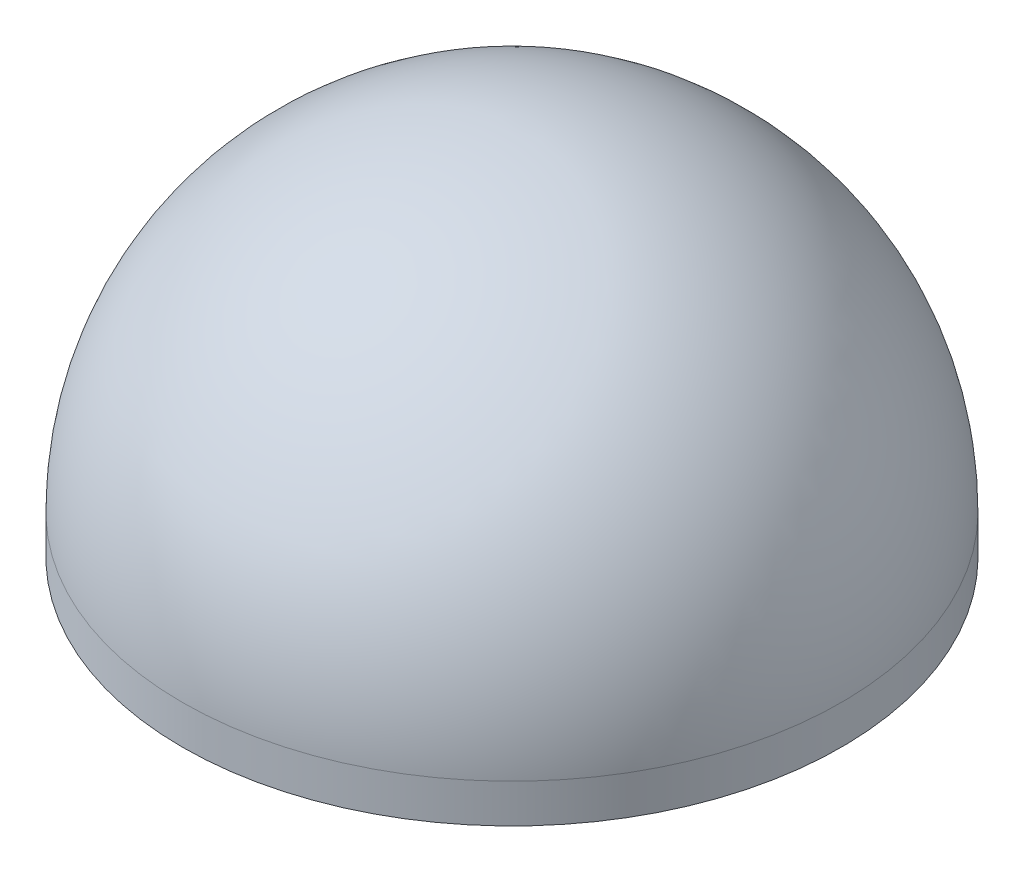
ISO-10303-21;
HEADER;
FILE_DESCRIPTION(('STEP AP214'),'2;1');
FILE_NAME('part.step','',(''),(''),'','','');
FILE_SCHEMA(('AUTOMOTIVE_DESIGN { 1 0 10303 214 1 1 1 1 }'));
ENDSEC;
DATA;
#1=APPLICATION_CONTEXT('core data for automotive mechanical design processes');
#2=APPLICATION_PROTOCOL_DEFINITION('international standard','automotive_design',2000,#1);
#3=PRODUCT_CONTEXT('',#1,'mechanical');
#4=PRODUCT('Part','Part','',(#3));
#5=PRODUCT_RELATED_PRODUCT_CATEGORY('part','',(#4));
#6=PRODUCT_DEFINITION_FORMATION('','',#4);
#7=PRODUCT_DEFINITION_CONTEXT('part definition',#1,'design');
#8=PRODUCT_DEFINITION('design','',#6,#7);
#9=PRODUCT_DEFINITION_SHAPE('','',#8);
#10=(LENGTH_UNIT() NAMED_UNIT(*) SI_UNIT(.MILLI.,.METRE.));
#11=(NAMED_UNIT(*) PLANE_ANGLE_UNIT() SI_UNIT($,.RADIAN.));
#12=(NAMED_UNIT(*) SI_UNIT($,.STERADIAN.) SOLID_ANGLE_UNIT());
#13=UNCERTAINTY_MEASURE_WITH_UNIT(LENGTH_MEASURE(1.E-05),#10,'distance_accuracy_value','');
#14=(GEOMETRIC_REPRESENTATION_CONTEXT(3) GLOBAL_UNCERTAINTY_ASSIGNED_CONTEXT((#13)) GLOBAL_UNIT_ASSIGNED_CONTEXT((#10,
#11,#12)) REPRESENTATION_CONTEXT('',''));
#15=CARTESIAN_POINT('',(0.,0.,0.));
#16=DIRECTION('',(0.,0.,1.));
#17=DIRECTION('',(1.,0.,0.));
#18=AXIS2_PLACEMENT_3D('',#15,#16,#17);
#19=CARTESIAN_POINT('',(0.,2.,0.));
#20=DIRECTION('',(0.,-1.,0.));
#21=DIRECTION('',(0.,0.,-1.));
#22=AXIS2_PLACEMENT_3D('',#19,#20,#21);
#23=CYLINDRICAL_SURFACE('',#22,17.);
#24=CARTESIAN_POINT('',(0.,2.,0.));
#25=DIRECTION('',(0.,1.,0.));
#26=DIRECTION('',(0.,0.,1.));
#27=AXIS2_PLACEMENT_3D('',#24,#25,#26);
#28=CIRCLE('',#27,17.);
#29=CARTESIAN_POINT('',(0.,2.,17.));
#30=VERTEX_POINT('',#29);
#31=EDGE_CURVE('E10',#30,#30,#28,.T.);
#32=ORIENTED_EDGE('',*,*,#31,.F.);
#33=EDGE_LOOP('',(#32));
#34=FACE_BOUND('',#33,.T.);
#35=CARTESIAN_POINT('',(0.,0.,0.));
#36=DIRECTION('',(0.,1.,0.));
#37=DIRECTION('',(0.,0.,1.));
#38=AXIS2_PLACEMENT_3D('',#35,#36,#37);
#39=CIRCLE('',#38,17.);
#40=CARTESIAN_POINT('',(0.,0.,17.));
#41=VERTEX_POINT('',#40);
#42=EDGE_CURVE('E35',#41,#41,#39,.T.);
#43=ORIENTED_EDGE('',*,*,#42,.T.);
#44=EDGE_LOOP('',(#43));
#45=FACE_BOUND('',#44,.T.);
#46=ADVANCED_FACE('F32',(#34,#45),#23,.T.);
#47=CARTESIAN_POINT('',(0.,0.,0.));
#48=DIRECTION('',(0.,1.,0.));
#49=DIRECTION('',(0.,0.,1.));
#50=AXIS2_PLACEMENT_3D('',#47,#48,#49);
#51=PLANE('',#50);
#52=CARTESIAN_POINT('',(0.,0.,0.));
#53=DIRECTION('',(0.,-1.,0.));
#54=DIRECTION('',(0.,0.,-1.));
#55=AXIS2_PLACEMENT_3D('',#52,#53,#54);
#56=CIRCLE('',#55,11.);
#57=CARTESIAN_POINT('',(0.,0.,-11.));
#58=VERTEX_POINT('',#57);
#59=EDGE_CURVE('E44',#58,#58,#56,.T.);
#60=ORIENTED_EDGE('',*,*,#59,.F.);
#61=EDGE_LOOP('',(#60));
#62=FACE_BOUND('',#61,.T.);
#63=ORIENTED_EDGE('',*,*,#42,.F.);
#64=EDGE_LOOP('',(#63));
#65=FACE_BOUND('',#64,.T.);
#66=ADVANCED_FACE('F59',(#62,#65),#51,.F.);
#67=CARTESIAN_POINT('',(0.,2.,0.));
#68=DIRECTION('',(-1.,0.,0.));
#69=DIRECTION('',(0.,0.,1.));
#70=AXIS2_PLACEMENT_3D('',#67,#68,#69);
#71=SPHERICAL_SURFACE('',#70,17.);
#72=CARTESIAN_POINT('',(0.,2.,0.));
#73=DIRECTION('',(0.,1.,0.));
#74=DIRECTION('',(0.,0.,1.));
#75=AXIS2_PLACEMENT_3D('',#72,#73,#74);
#76=SPHERICAL_SURFACE('',#75,17.);
#77=ORIENTED_EDGE('',*,*,#31,.T.);
#78=EDGE_LOOP('',(#77));
#79=FACE_BOUND('',#78,.T.);
#80=ADVANCED_FACE('F55',(#79),#76,.T.);
#81=CARTESIAN_POINT('',(0.,4.,0.));
#82=DIRECTION('',(0.,-1.,0.));
#83=DIRECTION('',(0.,0.,-1.));
#84=AXIS2_PLACEMENT_3D('',#81,#82,#83);
#85=CYLINDRICAL_SURFACE('',#84,11.);
#86=CARTESIAN_POINT('',(0.,4.,0.));
#87=DIRECTION('',(0.,-1.,0.));
#88=DIRECTION('',(0.,0.,-1.));
#89=AXIS2_PLACEMENT_3D('',#86,#87,#88);
#90=CIRCLE('',#89,11.);
#91=CARTESIAN_POINT('',(0.,4.,-11.));
#92=VERTEX_POINT('',#91);
#93=EDGE_CURVE('E42',#92,#92,#90,.T.);
#94=ORIENTED_EDGE('',*,*,#93,.F.);
#95=EDGE_LOOP('',(#94));
#96=FACE_BOUND('',#95,.T.);
#97=ORIENTED_EDGE('',*,*,#59,.T.);
#98=EDGE_LOOP('',(#97));
#99=FACE_BOUND('',#98,.T.);
#100=ADVANCED_FACE('F52',(#96,#99),#85,.F.);
#101=CARTESIAN_POINT('',(0.,4.,0.));
#102=DIRECTION('',(0.,-1.,0.));
#103=DIRECTION('',(0.,0.,-1.));
#104=AXIS2_PLACEMENT_3D('',#101,#102,#103);
#105=PLANE('',#104);
#106=ORIENTED_EDGE('',*,*,#93,.T.);
#107=EDGE_LOOP('',(#106));
#108=FACE_BOUND('',#107,.T.);
#109=ADVANCED_FACE('F50',(#108),#105,.T.);
#110=CLOSED_SHELL('',(#46,#66,#80,#100,#109));
#111=MANIFOLD_SOLID_BREP('B2',#110);
#112=ADVANCED_BREP_SHAPE_REPRESENTATION('',(#18,#111),#14);
#113=SHAPE_DEFINITION_REPRESENTATION(#9,#112);
ENDSEC;
END-ISO-10303-21;
